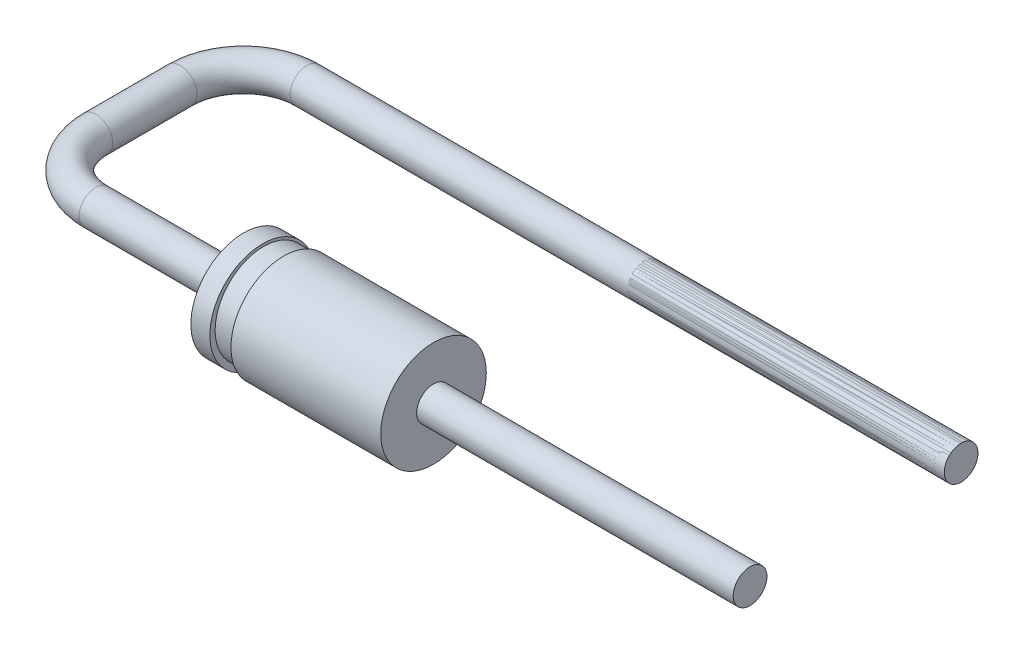
ISO-10303-21;
HEADER;
FILE_DESCRIPTION(('STEP AP214'),'2;1');
FILE_NAME('part.step','',(''),(''),'','','');
FILE_SCHEMA(('AUTOMOTIVE_DESIGN { 1 0 10303 214 1 1 1 1 }'));
ENDSEC;
DATA;
#1=APPLICATION_CONTEXT('core data for automotive mechanical design processes');
#2=APPLICATION_PROTOCOL_DEFINITION('international standard','automotive_design',2000,#1);
#3=PRODUCT_CONTEXT('',#1,'mechanical');
#4=PRODUCT('Part','Part','',(#3));
#5=PRODUCT_RELATED_PRODUCT_CATEGORY('part','',(#4));
#6=PRODUCT_DEFINITION_FORMATION('','',#4);
#7=PRODUCT_DEFINITION_CONTEXT('part definition',#1,'design');
#8=PRODUCT_DEFINITION('design','',#6,#7);
#9=PRODUCT_DEFINITION_SHAPE('','',#8);
#10=(LENGTH_UNIT() NAMED_UNIT(*) SI_UNIT(.MILLI.,.METRE.));
#11=(NAMED_UNIT(*) PLANE_ANGLE_UNIT() SI_UNIT($,.RADIAN.));
#12=(NAMED_UNIT(*) SI_UNIT($,.STERADIAN.) SOLID_ANGLE_UNIT());
#13=UNCERTAINTY_MEASURE_WITH_UNIT(LENGTH_MEASURE(1.E-05),#10,'distance_accuracy_value','');
#14=(GEOMETRIC_REPRESENTATION_CONTEXT(3) GLOBAL_UNCERTAINTY_ASSIGNED_CONTEXT((#13)) GLOBAL_UNIT_ASSIGNED_CONTEXT((#10,
#11,#12)) REPRESENTATION_CONTEXT('',''));
#15=CARTESIAN_POINT('',(0.,0.,0.));
#16=DIRECTION('',(0.,0.,1.));
#17=DIRECTION('',(1.,0.,0.));
#18=AXIS2_PLACEMENT_3D('',#15,#16,#17);
#19=CARTESIAN_POINT('',(7.45,0.,-3.475));
#20=DIRECTION('',(1.,0.,0.));
#21=DIRECTION('',(0.,0.,-1.));
#22=AXIS2_PLACEMENT_3D('',#19,#20,#21);
#23=CYLINDRICAL_SURFACE('',#22,0.4);
#24=CARTESIAN_POINT('',(7.45,0.,-3.475));
#25=DIRECTION('',(1.,0.,0.));
#26=DIRECTION('',(0.,0.,-1.));
#27=AXIS2_PLACEMENT_3D('',#24,#25,#26);
#28=CIRCLE('',#27,0.4);
#29=CARTESIAN_POINT('',(7.45,0.,-3.875));
#30=VERTEX_POINT('',#29);
#31=EDGE_CURVE('E11',#30,#30,#28,.T.);
#32=ORIENTED_EDGE('',*,*,#31,.T.);
#33=EDGE_LOOP('',(#32));
#34=FACE_BOUND('',#33,.T.);
#35=CARTESIAN_POINT('',(14.95,0.,-3.475));
#36=DIRECTION('',(1.,0.,0.));
#37=DIRECTION('',(0.,0.,-1.));
#38=AXIS2_PLACEMENT_3D('',#35,#36,#37);
#39=CIRCLE('',#38,0.4);
#40=CARTESIAN_POINT('',(14.95,0.,-3.875));
#41=VERTEX_POINT('',#40);
#42=EDGE_CURVE('E42',#41,#41,#39,.T.);
#43=ORIENTED_EDGE('',*,*,#42,.F.);
#44=EDGE_LOOP('',(#43));
#45=FACE_BOUND('',#44,.T.);
#46=ADVANCED_FACE('F39',(#34,#45),#23,.T.);
#47=CARTESIAN_POINT('',(7.45,0.,-3.475));
#48=DIRECTION('',(1.,0.,0.));
#49=DIRECTION('',(0.,0.,-1.));
#50=AXIS2_PLACEMENT_3D('',#47,#48,#49);
#51=PLANE('',#50);
#52=ORIENTED_EDGE('',*,*,#31,.F.);
#53=EDGE_LOOP('',(#52));
#54=FACE_BOUND('',#53,.T.);
#55=ADVANCED_FACE('F54',(#54),#51,.F.);
#56=CARTESIAN_POINT('',(14.95,0.,-3.475));
#57=DIRECTION('',(1.,0.,0.));
#58=DIRECTION('',(0.,0.,-1.));
#59=AXIS2_PLACEMENT_3D('',#56,#57,#58);
#60=PLANE('',#59);
#61=ORIENTED_EDGE('',*,*,#42,.T.);
#62=EDGE_LOOP('',(#61));
#63=FACE_BOUND('',#62,.T.);
#64=ADVANCED_FACE('F51',(#63),#60,.T.);
#65=CLOSED_SHELL('',(#46,#55,#64));
#66=MANIFOLD_SOLID_BREP('B2',#65);
#67=CARTESIAN_POINT('',(14.95,0.,-3.475));
#68=DIRECTION('',(-1.,0.,0.));
#69=DIRECTION('',(0.,0.,1.));
#70=AXIS2_PLACEMENT_3D('',#67,#68,#69);
#71=CYLINDRICAL_SURFACE('',#70,0.4);
#72=CARTESIAN_POINT('',(14.95,0.,-3.475));
#73=DIRECTION('',(1.,0.,0.));
#74=DIRECTION('',(0.,0.,-1.));
#75=AXIS2_PLACEMENT_3D('',#72,#73,#74);
#76=CIRCLE('',#75,0.4);
#77=CARTESIAN_POINT('',(14.95,0.,-3.875));
#78=VERTEX_POINT('',#77);
#79=EDGE_CURVE('E93',#78,#78,#76,.T.);
#80=ORIENTED_EDGE('',*,*,#79,.T.);
#81=EDGE_LOOP('',(#80));
#82=FACE_BOUND('',#81,.T.);
#83=CARTESIAN_POINT('',(-0.55,0.,-3.475));
#84=DIRECTION('',(1.,0.,0.));
#85=DIRECTION('',(0.,0.,-1.));
#86=AXIS2_PLACEMENT_3D('',#83,#84,#85);
#87=CIRCLE('',#86,0.4);
#88=CARTESIAN_POINT('',(-0.55,0.,-3.875));
#89=VERTEX_POINT('',#88);
#90=EDGE_CURVE('E38',#89,#89,#87,.T.);
#91=ORIENTED_EDGE('',*,*,#90,.F.);
#92=EDGE_LOOP('',(#91));
#93=FACE_BOUND('',#92,.T.);
#94=ADVANCED_FACE('F86',(#82,#93),#71,.F.);
#95=CARTESIAN_POINT('',(-0.55,0.,-1.975));
#96=DIRECTION('',(0.,1.,0.));
#97=DIRECTION('',(0.,0.,1.));
#98=AXIS2_PLACEMENT_3D('',#95,#96,#97);
#99=TOROIDAL_SURFACE('',#98,1.5,0.4);
#100=CARTESIAN_POINT('',(-2.05,0.,-1.975));
#101=DIRECTION('',(0.,0.,-1.));
#102=DIRECTION('',(-1.,0.,0.));
#103=AXIS2_PLACEMENT_3D('',#100,#101,#102);
#104=CIRCLE('',#103,0.4);
#105=CARTESIAN_POINT('',(-2.45,0.,-1.975));
#106=VERTEX_POINT('',#105);
#107=EDGE_CURVE('E99',#106,#106,#104,.T.);
#108=CARTESIAN_POINT('',(-0.55,0.,-1.975));
#109=DIRECTION('',(0.,1.,0.));
#110=DIRECTION('',(0.,0.,1.));
#111=AXIS2_PLACEMENT_3D('',#108,#109,#110);
#112=CIRCLE('',#111,1.9);
#113=EDGE_CURVE('',#89,#106,#112,.T.);
#114=ORIENTED_EDGE('',*,*,#90,.T.);
#115=ORIENTED_EDGE('',*,*,#107,.F.);
#116=ORIENTED_EDGE('',*,*,#113,.T.);
#117=ORIENTED_EDGE('',*,*,#113,.F.);
#118=EDGE_LOOP('',(#114,#116,#115,#117));
#119=FACE_BOUND('',#118,.T.);
#120=ADVANCED_FACE('F122',(#119),#99,.F.);
#121=CARTESIAN_POINT('',(-2.05,0.,-1.975));
#122=DIRECTION('',(0.,0.,1.));
#123=DIRECTION('',(1.,0.,0.));
#124=AXIS2_PLACEMENT_3D('',#121,#122,#123);
#125=CYLINDRICAL_SURFACE('',#124,0.4);
#126=ORIENTED_EDGE('',*,*,#107,.T.);
#127=EDGE_LOOP('',(#126));
#128=FACE_BOUND('',#127,.T.);
#129=CARTESIAN_POINT('',(-2.05,0.,0.0250000000000011));
#130=DIRECTION('',(0.,0.,-1.));
#131=DIRECTION('',(-1.,0.,0.));
#132=AXIS2_PLACEMENT_3D('',#129,#130,#131);
#133=CIRCLE('',#132,0.4);
#134=CARTESIAN_POINT('',(-2.45,0.,0.0250000000000014));
#135=VERTEX_POINT('',#134);
#136=EDGE_CURVE('E104',#135,#135,#133,.T.);
#137=ORIENTED_EDGE('',*,*,#136,.F.);
#138=EDGE_LOOP('',(#137));
#139=FACE_BOUND('',#138,.T.);
#140=ADVANCED_FACE('F117',(#128,#139),#125,.F.);
#141=CARTESIAN_POINT('',(-0.55,0.,0.0250000000000003));
#142=DIRECTION('',(0.,1.,0.));
#143=DIRECTION('',(0.,0.,1.));
#144=AXIS2_PLACEMENT_3D('',#141,#142,#143);
#145=TOROIDAL_SURFACE('',#144,1.5,0.4);
#146=CARTESIAN_POINT('',(-0.549999999999999,0.,1.525));
#147=DIRECTION('',(-1.,0.,0.));
#148=DIRECTION('',(0.,0.,1.));
#149=AXIS2_PLACEMENT_3D('',#146,#147,#148);
#150=CIRCLE('',#149,0.4);
#151=CARTESIAN_POINT('',(-0.549999999999999,0.,1.925));
#152=VERTEX_POINT('',#151);
#153=EDGE_CURVE('E106',#152,#152,#150,.T.);
#154=CARTESIAN_POINT('',(-0.55,0.,0.0250000000000003));
#155=DIRECTION('',(0.,1.,0.));
#156=DIRECTION('',(0.,0.,1.));
#157=AXIS2_PLACEMENT_3D('',#154,#155,#156);
#158=CIRCLE('',#157,1.9);
#159=EDGE_CURVE('',#135,#152,#158,.T.);
#160=ORIENTED_EDGE('',*,*,#136,.T.);
#161=ORIENTED_EDGE('',*,*,#153,.F.);
#162=ORIENTED_EDGE('',*,*,#159,.T.);
#163=ORIENTED_EDGE('',*,*,#159,.F.);
#164=EDGE_LOOP('',(#160,#162,#161,#163));
#165=FACE_BOUND('',#164,.T.);
#166=ADVANCED_FACE('F87',(#165),#145,.F.);
#167=CARTESIAN_POINT('',(-0.549999999999999,0.,1.525));
#168=DIRECTION('',(1.,0.,0.));
#169=DIRECTION('',(0.,0.,-1.));
#170=AXIS2_PLACEMENT_3D('',#167,#168,#169);
#171=CYLINDRICAL_SURFACE('',#170,0.4);
#172=ORIENTED_EDGE('',*,*,#153,.T.);
#173=EDGE_LOOP('',(#172));
#174=FACE_BOUND('',#173,.T.);
#175=CARTESIAN_POINT('',(2.95,0.,1.525));
#176=DIRECTION('',(-1.,0.,0.));
#177=DIRECTION('',(0.,0.,1.));
#178=AXIS2_PLACEMENT_3D('',#175,#176,#177);
#179=CIRCLE('',#178,0.4);
#180=CARTESIAN_POINT('',(2.95,0.,1.925));
#181=VERTEX_POINT('',#180);
#182=EDGE_CURVE('E90',#181,#181,#179,.T.);
#183=ORIENTED_EDGE('',*,*,#182,.F.);
#184=EDGE_LOOP('',(#183));
#185=FACE_BOUND('',#184,.T.);
#186=ADVANCED_FACE('F88',(#174,#185),#171,.F.);
#187=OPEN_SHELL('',(#94,#120,#140,#166,#186));
#188=SHELL_BASED_SURFACE_MODEL('B6',(#187));
#189=CARTESIAN_POINT('',(7.45,-0.0336492653327545,1.525));
#190=DIRECTION('',(1.,0.,0.));
#191=DIRECTION('',(0.,0.,-1.));
#192=AXIS2_PLACEMENT_3D('',#189,#190,#191);
#193=PLANE('',#192);
#194=CARTESIAN_POINT('',(7.45,-0.0336492653327545,1.525));
#195=DIRECTION('',(1.,0.,0.));
#196=DIRECTION('',(0.,0.,-1.));
#197=AXIS2_PLACEMENT_3D('',#194,#195,#196);
#198=CIRCLE('',#197,1.25);
#199=CARTESIAN_POINT('',(7.45,-0.0336492653327545,0.275));
#200=VERTEX_POINT('',#199);
#201=EDGE_CURVE('E85',#200,#200,#198,.T.);
#202=ORIENTED_EDGE('',*,*,#201,.T.);
#203=EDGE_LOOP('',(#202));
#204=FACE_BOUND('',#203,.T.);
#205=CARTESIAN_POINT('',(7.45,-0.0336492653327545,1.525));
#206=DIRECTION('',(1.,0.,0.));
#207=DIRECTION('',(0.,0.,-1.));
#208=AXIS2_PLACEMENT_3D('',#205,#206,#207);
#209=CIRCLE('',#208,0.4);
#210=CARTESIAN_POINT('',(7.45,-0.0336492653327545,1.125));
#211=VERTEX_POINT('',#210);
#212=EDGE_CURVE('E201',#211,#211,#209,.T.);
#213=ORIENTED_EDGE('',*,*,#212,.F.);
#214=EDGE_LOOP('',(#213));
#215=FACE_BOUND('',#214,.T.);
#216=ADVANCED_FACE('F170',(#204,#215),#193,.T.);
#217=CARTESIAN_POINT('',(7.45,-0.0336492653327545,1.525));
#218=DIRECTION('',(-1.,0.,0.));
#219=DIRECTION('',(0.,0.,1.));
#220=AXIS2_PLACEMENT_3D('',#217,#218,#219);
#221=CYLINDRICAL_SURFACE('',#220,1.25);
#222=CARTESIAN_POINT('',(2.95,-0.0336492653327545,1.525));
#223=DIRECTION('',(1.,0.,0.));
#224=DIRECTION('',(0.,0.,-1.));
#225=AXIS2_PLACEMENT_3D('',#222,#223,#224);
#226=CIRCLE('',#225,1.25);
#227=CARTESIAN_POINT('',(2.95,-0.0336492653327545,0.275));
#228=VERTEX_POINT('',#227);
#229=EDGE_CURVE('E178',#228,#228,#226,.T.);
#230=ORIENTED_EDGE('',*,*,#229,.T.);
#231=EDGE_LOOP('',(#230));
#232=FACE_BOUND('',#231,.T.);
#233=CARTESIAN_POINT('',(3.4,-0.0336492653327545,1.525));
#234=DIRECTION('',(1.,0.,0.));
#235=DIRECTION('',(0.,0.,-1.));
#236=AXIS2_PLACEMENT_3D('',#233,#234,#235);
#237=CIRCLE('',#236,1.25);
#238=CARTESIAN_POINT('',(3.4,-0.0336492653327545,0.275));
#239=VERTEX_POINT('',#238);
#240=EDGE_CURVE('E174',#239,#239,#237,.T.);
#241=ORIENTED_EDGE('',*,*,#240,.F.);
#242=EDGE_LOOP('',(#241));
#243=FACE_BOUND('',#242,.T.);
#244=ADVANCED_FACE('F172',(#232,#243),#221,.T.);
#245=CARTESIAN_POINT('',(2.95,-0.0336492653327545,1.525));
#246=DIRECTION('',(1.,0.,0.));
#247=DIRECTION('',(0.,0.,-1.));
#248=AXIS2_PLACEMENT_3D('',#245,#246,#247);
#249=PLANE('',#248);
#250=ORIENTED_EDGE('',*,*,#229,.F.);
#251=EDGE_LOOP('',(#250));
#252=FACE_BOUND('',#251,.T.);
#253=ADVANCED_FACE('F214',(#252),#249,.F.);
#254=CARTESIAN_POINT('',(3.4,0.,-0.15));
#255=DIRECTION('',(1.,0.,0.));
#256=DIRECTION('',(0.,0.,-1.));
#257=AXIS2_PLACEMENT_3D('',#254,#255,#256);
#258=PLANE('',#257);
#259=CARTESIAN_POINT('',(3.4,0.,1.5));
#260=DIRECTION('',(-1.,0.,0.));
#261=DIRECTION('',(0.,0.,1.));
#262=AXIS2_PLACEMENT_3D('',#259,#260,#261);
#263=CIRCLE('',#262,1.15);
#264=CARTESIAN_POINT('',(3.4,0.,2.65));
#265=VERTEX_POINT('',#264);
#266=EDGE_CURVE('E185',#265,#265,#263,.T.);
#267=ORIENTED_EDGE('',*,*,#266,.T.);
#268=EDGE_LOOP('',(#267));
#269=FACE_BOUND('',#268,.T.);
#270=ORIENTED_EDGE('',*,*,#240,.T.);
#271=EDGE_LOOP('',(#270));
#272=FACE_BOUND('',#271,.T.);
#273=ADVANCED_FACE('F218',(#269,#272),#258,.T.);
#274=CARTESIAN_POINT('',(3.9,0.,-0.15));
#275=DIRECTION('',(-1.,0.,0.));
#276=DIRECTION('',(0.,0.,1.));
#277=AXIS2_PLACEMENT_3D('',#274,#275,#276);
#278=PLANE('',#277);
#279=CARTESIAN_POINT('',(3.9,0.,1.5));
#280=DIRECTION('',(-1.,0.,0.));
#281=DIRECTION('',(0.,0.,1.));
#282=AXIS2_PLACEMENT_3D('',#279,#280,#281);
#283=CIRCLE('',#282,1.15);
#284=CARTESIAN_POINT('',(3.9,0.,2.65));
#285=VERTEX_POINT('',#284);
#286=EDGE_CURVE('E193',#285,#285,#283,.T.);
#287=ORIENTED_EDGE('',*,*,#286,.F.);
#288=EDGE_LOOP('',(#287));
#289=FACE_BOUND('',#288,.T.);
#290=CARTESIAN_POINT('',(3.9,-0.0336492653327545,1.525));
#291=DIRECTION('',(-1.,0.,0.));
#292=DIRECTION('',(0.,0.,1.));
#293=AXIS2_PLACEMENT_3D('',#290,#291,#292);
#294=CIRCLE('',#293,1.25);
#295=CARTESIAN_POINT('',(3.9,-0.0336492653327545,2.775));
#296=VERTEX_POINT('',#295);
#297=EDGE_CURVE('E187',#296,#296,#294,.T.);
#298=ORIENTED_EDGE('',*,*,#297,.T.);
#299=EDGE_LOOP('',(#298));
#300=FACE_BOUND('',#299,.T.);
#301=ADVANCED_FACE('F225',(#289,#300),#278,.T.);
#302=CARTESIAN_POINT('',(0.,0.,1.5));
#303=DIRECTION('',(-1.,0.,0.));
#304=DIRECTION('',(0.,0.,1.));
#305=AXIS2_PLACEMENT_3D('',#302,#303,#304);
#306=CYLINDRICAL_SURFACE('',#305,1.15);
#307=ORIENTED_EDGE('',*,*,#286,.T.);
#308=EDGE_LOOP('',(#307));
#309=FACE_BOUND('',#308,.T.);
#310=ORIENTED_EDGE('',*,*,#266,.F.);
#311=EDGE_LOOP('',(#310));
#312=FACE_BOUND('',#311,.T.);
#313=ADVANCED_FACE('F233',(#309,#312),#306,.T.);
#314=ORIENTED_EDGE('',*,*,#201,.F.);
#315=EDGE_LOOP('',(#314));
#316=FACE_BOUND('',#315,.T.);
#317=ORIENTED_EDGE('',*,*,#297,.F.);
#318=EDGE_LOOP('',(#317));
#319=FACE_BOUND('',#318,.T.);
#320=ADVANCED_FACE('F216',(#316,#319),#221,.T.);
#321=CARTESIAN_POINT('',(14.95,-0.0336492653327545,1.525));
#322=DIRECTION('',(-1.,0.,0.));
#323=DIRECTION('',(0.,0.,1.));
#324=AXIS2_PLACEMENT_3D('',#321,#322,#323);
#325=CYLINDRICAL_SURFACE('',#324,0.4);
#326=CARTESIAN_POINT('',(14.95,-0.0336492653327545,1.525));
#327=DIRECTION('',(1.,0.,0.));
#328=DIRECTION('',(0.,0.,-1.));
#329=AXIS2_PLACEMENT_3D('',#326,#327,#328);
#330=CIRCLE('',#329,0.4);
#331=CARTESIAN_POINT('',(14.95,-0.0336492653327545,1.125));
#332=VERTEX_POINT('',#331);
#333=EDGE_CURVE('E197',#332,#332,#330,.T.);
#334=ORIENTED_EDGE('',*,*,#333,.F.);
#335=EDGE_LOOP('',(#334));
#336=FACE_BOUND('',#335,.T.);
#337=ORIENTED_EDGE('',*,*,#212,.T.);
#338=EDGE_LOOP('',(#337));
#339=FACE_BOUND('',#338,.T.);
#340=ADVANCED_FACE('F207',(#336,#339),#325,.T.);
#341=CARTESIAN_POINT('',(14.95,-0.0336492653327545,1.525));
#342=DIRECTION('',(1.,0.,0.));
#343=DIRECTION('',(0.,0.,-1.));
#344=AXIS2_PLACEMENT_3D('',#341,#342,#343);
#345=PLANE('',#344);
#346=ORIENTED_EDGE('',*,*,#333,.T.);
#347=EDGE_LOOP('',(#346));
#348=FACE_BOUND('',#347,.T.);
#349=ADVANCED_FACE('F242',(#348),#345,.T.);
#350=CLOSED_SHELL('',(#216,#244,#253,#273,#301,#313,#320,#340,#349));
#351=MANIFOLD_SOLID_BREP('B33',#350);
#352=ADVANCED_BREP_SHAPE_REPRESENTATION('',(#18,#66,#351),#14);
#353=MANIFOLD_SURFACE_SHAPE_REPRESENTATION('',(#18,#188),#14);
#354=SHAPE_REPRESENTATION('',(#18),#14);
#355=SHAPE_DEFINITION_REPRESENTATION(#9,#354);
#356=SHAPE_REPRESENTATION_RELATIONSHIP('','',#354,#352);
#357=SHAPE_REPRESENTATION_RELATIONSHIP('','',#354,#353);
ENDSEC;
END-ISO-10303-21;
